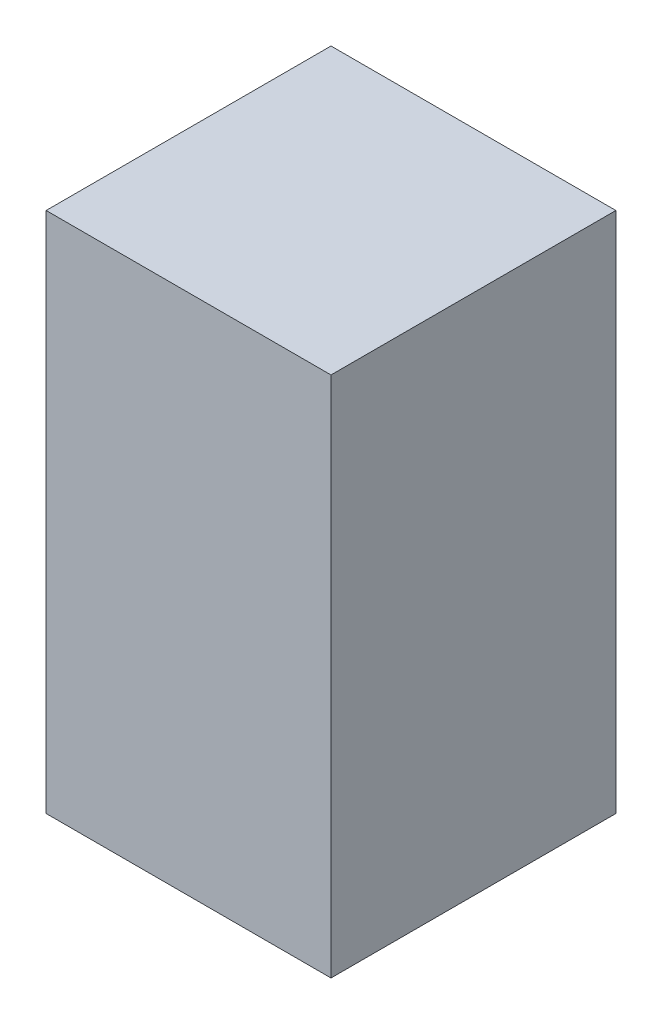
ISO-10303-21;
HEADER;
FILE_DESCRIPTION(('STEP AP214'),'2;1');
FILE_NAME('part.step','',(''),(''),'','','');
FILE_SCHEMA(('AUTOMOTIVE_DESIGN { 1 0 10303 214 1 1 1 1 }'));
ENDSEC;
DATA;
#1=APPLICATION_CONTEXT('core data for automotive mechanical design processes');
#2=APPLICATION_PROTOCOL_DEFINITION('international standard','automotive_design',2000,#1);
#3=PRODUCT_CONTEXT('',#1,'mechanical');
#4=PRODUCT('Part','Part','',(#3));
#5=PRODUCT_RELATED_PRODUCT_CATEGORY('part','',(#4));
#6=PRODUCT_DEFINITION_FORMATION('','',#4);
#7=PRODUCT_DEFINITION_CONTEXT('part definition',#1,'design');
#8=PRODUCT_DEFINITION('design','',#6,#7);
#9=PRODUCT_DEFINITION_SHAPE('','',#8);
#10=(LENGTH_UNIT() NAMED_UNIT(*) SI_UNIT(.MILLI.,.METRE.));
#11=(NAMED_UNIT(*) PLANE_ANGLE_UNIT() SI_UNIT($,.RADIAN.));
#12=(NAMED_UNIT(*) SI_UNIT($,.STERADIAN.) SOLID_ANGLE_UNIT());
#13=UNCERTAINTY_MEASURE_WITH_UNIT(LENGTH_MEASURE(1.E-05),#10,'distance_accuracy_value','');
#14=(GEOMETRIC_REPRESENTATION_CONTEXT(3) GLOBAL_UNCERTAINTY_ASSIGNED_CONTEXT((#13)) GLOBAL_UNIT_ASSIGNED_CONTEXT((#10,
#11,#12)) REPRESENTATION_CONTEXT('',''));
#15=CARTESIAN_POINT('',(0.,0.,0.));
#16=DIRECTION('',(0.,0.,1.));
#17=DIRECTION('',(1.,0.,0.));
#18=AXIS2_PLACEMENT_3D('',#15,#16,#17);
#19=CARTESIAN_POINT('',(0.45000164,0.82500216,0.90000074));
#20=DIRECTION('',(0.,0.,1.));
#21=DIRECTION('',(1.,0.,0.));
#22=AXIS2_PLACEMENT_3D('',#19,#20,#21);
#23=PLANE('',#22);
#24=DIRECTION('',(1.,0.,0.));
#25=VECTOR('',#24,1.);
#26=CARTESIAN_POINT('',(0.45000164,-0.82499962,0.90000074));
#27=LINE('',#26,#25);
#28=CARTESIAN_POINT('',(0.45000164,-0.82499962,0.90000074));
#29=VERTEX_POINT('',#28);
#30=CARTESIAN_POINT('',(-0.4499991,-0.82499962,0.90000074));
#31=VERTEX_POINT('',#30);
#32=EDGE_CURVE('E53',#29,#31,#27,.F.);
#33=ORIENTED_EDGE('',*,*,#32,.F.);
#34=DIRECTION('',(0.,1.,0.));
#35=VECTOR('',#34,1.);
#36=CARTESIAN_POINT('',(0.45000164,0.82500216,0.90000074));
#37=LINE('',#36,#35);
#38=CARTESIAN_POINT('',(0.45000164,0.82500216,0.90000074));
#39=VERTEX_POINT('',#38);
#40=EDGE_CURVE('E68',#39,#29,#37,.F.);
#41=ORIENTED_EDGE('',*,*,#40,.F.);
#42=DIRECTION('',(1.,0.,0.));
#43=VECTOR('',#42,1.);
#44=CARTESIAN_POINT('',(-0.4499991,0.82500216,0.90000074));
#45=LINE('',#44,#43);
#46=CARTESIAN_POINT('',(-0.4499991,0.82500216,0.90000074));
#47=VERTEX_POINT('',#46);
#48=EDGE_CURVE('E20',#47,#39,#45,.T.);
#49=ORIENTED_EDGE('',*,*,#48,.F.);
#50=DIRECTION('',(0.,1.,0.));
#51=VECTOR('',#50,1.);
#52=CARTESIAN_POINT('',(-0.4499991,-0.82499962,0.90000074));
#53=LINE('',#52,#51);
#54=EDGE_CURVE('E58',#31,#47,#53,.T.);
#55=ORIENTED_EDGE('',*,*,#54,.F.);
#56=EDGE_LOOP('',(#33,#41,#49,#55));
#57=FACE_BOUND('',#56,.T.);
#58=ADVANCED_FACE('F17',(#57),#23,.T.);
#59=CARTESIAN_POINT('',(-0.4499991,0.82500216,0.));
#60=DIRECTION('',(0.,1.,0.));
#61=DIRECTION('',(0.,0.,1.));
#62=AXIS2_PLACEMENT_3D('',#59,#60,#61);
#63=PLANE('',#62);
#64=DIRECTION('',(0.,0.,-1.));
#65=VECTOR('',#64,1.);
#66=CARTESIAN_POINT('',(0.45000164,0.82500216,0.));
#67=LINE('',#66,#65);
#68=CARTESIAN_POINT('',(0.45000164,0.82500216,0.));
#69=VERTEX_POINT('',#68);
#70=EDGE_CURVE('E79',#69,#39,#67,.F.);
#71=ORIENTED_EDGE('',*,*,#70,.F.);
#72=DIRECTION('',(1.,0.,0.));
#73=VECTOR('',#72,1.);
#74=CARTESIAN_POINT('',(0.45000164,0.82500216,0.));
#75=LINE('',#74,#73);
#76=CARTESIAN_POINT('',(-0.4499991,0.82500216,0.));
#77=VERTEX_POINT('',#76);
#78=EDGE_CURVE('E74',#69,#77,#75,.F.);
#79=ORIENTED_EDGE('',*,*,#78,.T.);
#80=DIRECTION('',(0.,0.,1.));
#81=VECTOR('',#80,1.);
#82=CARTESIAN_POINT('',(-0.4499991,0.82500216,0.));
#83=LINE('',#82,#81);
#84=EDGE_CURVE('E63',#47,#77,#83,.F.);
#85=ORIENTED_EDGE('',*,*,#84,.F.);
#86=ORIENTED_EDGE('',*,*,#48,.T.);
#87=EDGE_LOOP('',(#71,#79,#85,#86));
#88=FACE_BOUND('',#87,.T.);
#89=ADVANCED_FACE('F73',(#88),#63,.T.);
#90=CARTESIAN_POINT('',(-0.4499991,-0.82499962,0.));
#91=DIRECTION('',(-1.,0.,0.));
#92=DIRECTION('',(0.,0.,1.));
#93=AXIS2_PLACEMENT_3D('',#90,#91,#92);
#94=PLANE('',#93);
#95=ORIENTED_EDGE('',*,*,#84,.T.);
#96=DIRECTION('',(0.,1.,0.));
#97=VECTOR('',#96,1.);
#98=CARTESIAN_POINT('',(-0.4499991,0.82500216,0.));
#99=LINE('',#98,#97);
#100=CARTESIAN_POINT('',(-0.4499991,-0.82499962,0.));
#101=VERTEX_POINT('',#100);
#102=EDGE_CURVE('E84',#77,#101,#99,.F.);
#103=ORIENTED_EDGE('',*,*,#102,.T.);
#104=DIRECTION('',(0.,0.,-1.));
#105=VECTOR('',#104,1.);
#106=CARTESIAN_POINT('',(-0.4499991,-0.82499962,0.));
#107=LINE('',#106,#105);
#108=EDGE_CURVE('E65',#31,#101,#107,.T.);
#109=ORIENTED_EDGE('',*,*,#108,.F.);
#110=ORIENTED_EDGE('',*,*,#54,.T.);
#111=EDGE_LOOP('',(#95,#103,#109,#110));
#112=FACE_BOUND('',#111,.T.);
#113=ADVANCED_FACE('F60',(#112),#94,.T.);
#114=CARTESIAN_POINT('',(0.45000164,-0.82499962,0.));
#115=DIRECTION('',(0.,-1.,0.));
#116=DIRECTION('',(0.,0.,-1.));
#117=AXIS2_PLACEMENT_3D('',#114,#115,#116);
#118=PLANE('',#117);
#119=ORIENTED_EDGE('',*,*,#108,.T.);
#120=DIRECTION('',(1.,0.,0.));
#121=VECTOR('',#120,1.);
#122=CARTESIAN_POINT('',(0.45000164,-0.82499962,0.));
#123=LINE('',#122,#121);
#124=CARTESIAN_POINT('',(0.45000164,-0.82499962,0.));
#125=VERTEX_POINT('',#124);
#126=EDGE_CURVE('E26',#101,#125,#123,.T.);
#127=ORIENTED_EDGE('',*,*,#126,.T.);
#128=DIRECTION('',(0.,0.,-1.));
#129=VECTOR('',#128,1.);
#130=CARTESIAN_POINT('',(0.45000164,-0.82499962,0.));
#131=LINE('',#130,#129);
#132=EDGE_CURVE('E34',#29,#125,#131,.T.);
#133=ORIENTED_EDGE('',*,*,#132,.F.);
#134=ORIENTED_EDGE('',*,*,#32,.T.);
#135=EDGE_LOOP('',(#119,#127,#133,#134));
#136=FACE_BOUND('',#135,.T.);
#137=ADVANCED_FACE('F88',(#136),#118,.T.);
#138=CARTESIAN_POINT('',(0.45000164,0.82500216,0.));
#139=DIRECTION('',(1.,0.,0.));
#140=DIRECTION('',(0.,0.,-1.));
#141=AXIS2_PLACEMENT_3D('',#138,#139,#140);
#142=PLANE('',#141);
#143=ORIENTED_EDGE('',*,*,#132,.T.);
#144=DIRECTION('',(0.,1.,0.));
#145=VECTOR('',#144,1.);
#146=CARTESIAN_POINT('',(0.45000164,0.82500216,0.));
#147=LINE('',#146,#145);
#148=EDGE_CURVE('E11',#125,#69,#147,.T.);
#149=ORIENTED_EDGE('',*,*,#148,.T.);
#150=ORIENTED_EDGE('',*,*,#70,.T.);
#151=ORIENTED_EDGE('',*,*,#40,.T.);
#152=EDGE_LOOP('',(#143,#149,#150,#151));
#153=FACE_BOUND('',#152,.T.);
#154=ADVANCED_FACE('F91',(#153),#142,.T.);
#155=CARTESIAN_POINT('',(0.45000164,0.82500216,0.));
#156=DIRECTION('',(0.,0.,1.));
#157=DIRECTION('',(1.,0.,0.));
#158=AXIS2_PLACEMENT_3D('',#155,#156,#157);
#159=PLANE('',#158);
#160=ORIENTED_EDGE('',*,*,#126,.F.);
#161=ORIENTED_EDGE('',*,*,#102,.F.);
#162=ORIENTED_EDGE('',*,*,#78,.F.);
#163=ORIENTED_EDGE('',*,*,#148,.F.);
#164=EDGE_LOOP('',(#160,#161,#162,#163));
#165=FACE_BOUND('',#164,.T.);
#166=ADVANCED_FACE('F90',(#165),#159,.F.);
#167=CLOSED_SHELL('',(#58,#89,#113,#137,#154,#166));
#168=MANIFOLD_SOLID_BREP('B1',#167);
#169=ADVANCED_BREP_SHAPE_REPRESENTATION('',(#18,#168),#14);
#170=SHAPE_DEFINITION_REPRESENTATION(#9,#169);
ENDSEC;
END-ISO-10303-21;
